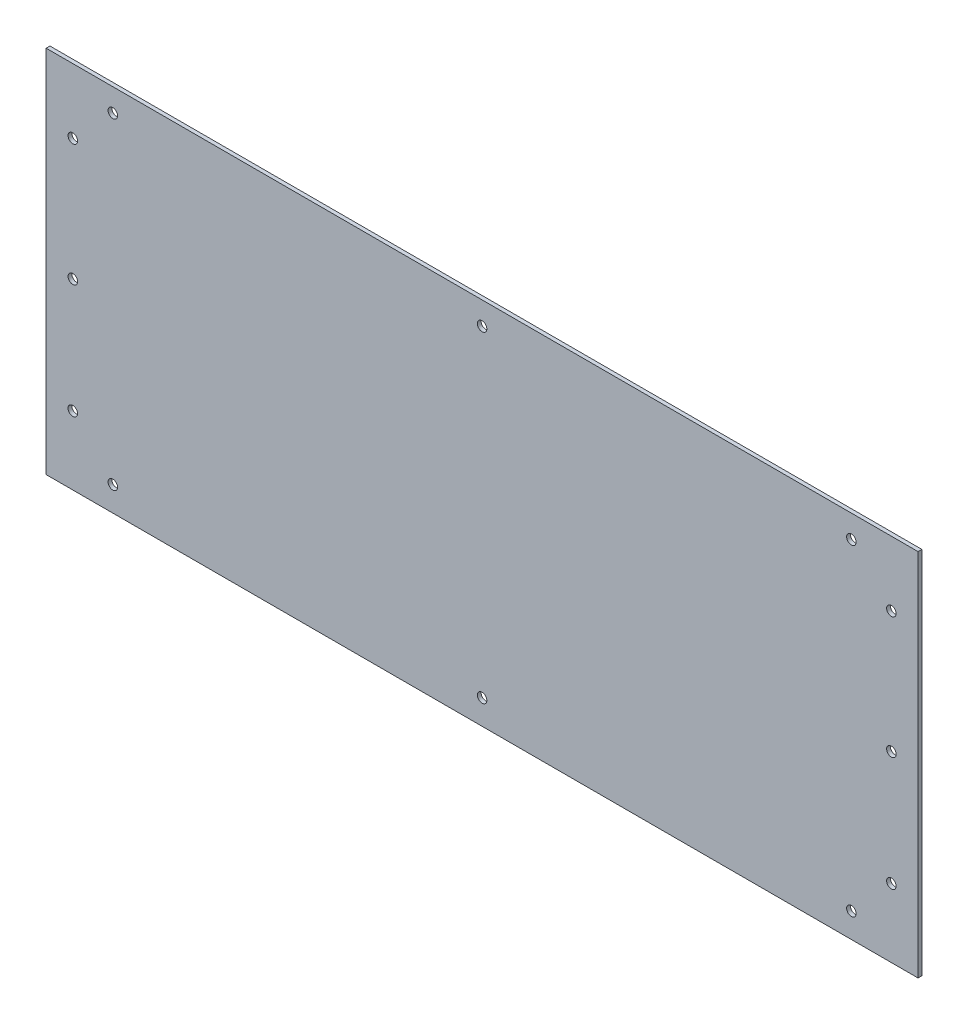
ISO-10303-21;
HEADER;
FILE_DESCRIPTION(('STEP AP214'),'2;1');
FILE_NAME('part.step','',(''),(''),'','','');
FILE_SCHEMA(('AUTOMOTIVE_DESIGN { 1 0 10303 214 1 1 1 1 }'));
ENDSEC;
DATA;
#1=APPLICATION_CONTEXT('core data for automotive mechanical design processes');
#2=APPLICATION_PROTOCOL_DEFINITION('international standard','automotive_design',2000,#1);
#3=PRODUCT_CONTEXT('',#1,'mechanical');
#4=PRODUCT('Part','Part','',(#3));
#5=PRODUCT_RELATED_PRODUCT_CATEGORY('part','',(#4));
#6=PRODUCT_DEFINITION_FORMATION('','',#4);
#7=PRODUCT_DEFINITION_CONTEXT('part definition',#1,'design');
#8=PRODUCT_DEFINITION('design','',#6,#7);
#9=PRODUCT_DEFINITION_SHAPE('','',#8);
#10=(LENGTH_UNIT() NAMED_UNIT(*) SI_UNIT(.MILLI.,.METRE.));
#11=(NAMED_UNIT(*) PLANE_ANGLE_UNIT() SI_UNIT($,.RADIAN.));
#12=(NAMED_UNIT(*) SI_UNIT($,.STERADIAN.) SOLID_ANGLE_UNIT());
#13=UNCERTAINTY_MEASURE_WITH_UNIT(LENGTH_MEASURE(1.E-05),#10,'distance_accuracy_value','');
#14=(GEOMETRIC_REPRESENTATION_CONTEXT(3) GLOBAL_UNCERTAINTY_ASSIGNED_CONTEXT((#13)) GLOBAL_UNIT_ASSIGNED_CONTEXT((#10,
#11,#12)) REPRESENTATION_CONTEXT('',''));
#15=CARTESIAN_POINT('',(0.,0.,0.));
#16=DIRECTION('',(0.,0.,1.));
#17=DIRECTION('',(1.,0.,0.));
#18=AXIS2_PLACEMENT_3D('',#15,#16,#17);
#19=CARTESIAN_POINT('',(229.,96.,2.));
#20=DIRECTION('',(-1.,0.,0.));
#21=DIRECTION('',(0.,-1.,0.));
#22=AXIS2_PLACEMENT_3D('',#19,#20,#21);
#23=PLANE('',#22);
#24=DIRECTION('',(0.,1.,0.));
#25=VECTOR('',#24,1.);
#26=CARTESIAN_POINT('',(229.,96.,0.));
#27=LINE('',#26,#25);
#28=CARTESIAN_POINT('',(229.,-96.,0.));
#29=VERTEX_POINT('',#28);
#30=CARTESIAN_POINT('',(229.,98.,0.));
#31=VERTEX_POINT('',#30);
#32=EDGE_CURVE('E206',#29,#31,#27,.T.);
#33=ORIENTED_EDGE('',*,*,#32,.T.);
#34=DIRECTION('',(0.,0.,1.));
#35=VECTOR('',#34,1.);
#36=CARTESIAN_POINT('',(229.,98.,0.));
#37=LINE('',#36,#35);
#38=CARTESIAN_POINT('',(229.,98.,2.));
#39=VERTEX_POINT('',#38);
#40=EDGE_CURVE('E102',#31,#39,#37,.T.);
#41=ORIENTED_EDGE('',*,*,#40,.T.);
#42=DIRECTION('',(0.,1.,0.));
#43=VECTOR('',#42,1.);
#44=CARTESIAN_POINT('',(229.,96.,2.));
#45=LINE('',#44,#43);
#46=CARTESIAN_POINT('',(229.,-96.,2.));
#47=VERTEX_POINT('',#46);
#48=EDGE_CURVE('E92',#47,#39,#45,.T.);
#49=ORIENTED_EDGE('',*,*,#48,.F.);
#50=DIRECTION('',(0.,0.,-1.));
#51=VECTOR('',#50,1.);
#52=CARTESIAN_POINT('',(229.,-96.,2.));
#53=LINE('',#52,#51);
#54=EDGE_CURVE('E53',#47,#29,#53,.T.);
#55=ORIENTED_EDGE('',*,*,#54,.T.);
#56=EDGE_LOOP('',(#33,#41,#49,#55));
#57=FACE_BOUND('',#56,.T.);
#58=ADVANCED_FACE('F44',(#57),#23,.F.);
#59=CARTESIAN_POINT('',(-229.,96.,2.));
#60=DIRECTION('',(1.,0.,0.));
#61=DIRECTION('',(0.,1.,0.));
#62=AXIS2_PLACEMENT_3D('',#59,#60,#61);
#63=PLANE('',#62);
#64=DIRECTION('',(0.,-1.,0.));
#65=VECTOR('',#64,1.);
#66=CARTESIAN_POINT('',(-229.,96.,0.));
#67=LINE('',#66,#65);
#68=CARTESIAN_POINT('',(-229.,98.,0.));
#69=VERTEX_POINT('',#68);
#70=CARTESIAN_POINT('',(-229.,-96.,0.));
#71=VERTEX_POINT('',#70);
#72=EDGE_CURVE('E72',#69,#71,#67,.T.);
#73=ORIENTED_EDGE('',*,*,#72,.T.);
#74=DIRECTION('',(0.,0.,-1.));
#75=VECTOR('',#74,1.);
#76=CARTESIAN_POINT('',(-229.,-96.,2.));
#77=LINE('',#76,#75);
#78=CARTESIAN_POINT('',(-229.,-96.,2.));
#79=VERTEX_POINT('',#78);
#80=EDGE_CURVE('E11',#79,#71,#77,.T.);
#81=ORIENTED_EDGE('',*,*,#80,.F.);
#82=DIRECTION('',(0.,-1.,0.));
#83=VECTOR('',#82,1.);
#84=CARTESIAN_POINT('',(-229.,96.,2.));
#85=LINE('',#84,#83);
#86=CARTESIAN_POINT('',(-229.,98.,2.));
#87=VERTEX_POINT('',#86);
#88=EDGE_CURVE('E85',#87,#79,#85,.T.);
#89=ORIENTED_EDGE('',*,*,#88,.F.);
#90=DIRECTION('',(0.,0.,1.));
#91=VECTOR('',#90,1.);
#92=CARTESIAN_POINT('',(-229.,98.,0.));
#93=LINE('',#92,#91);
#94=EDGE_CURVE('E88',#69,#87,#93,.T.);
#95=ORIENTED_EDGE('',*,*,#94,.F.);
#96=EDGE_LOOP('',(#73,#81,#89,#95));
#97=FACE_BOUND('',#96,.T.);
#98=ADVANCED_FACE('F87',(#97),#63,.F.);
#99=CARTESIAN_POINT('',(-229.,-96.,2.));
#100=DIRECTION('',(0.,1.,0.));
#101=DIRECTION('',(0.,0.,1.));
#102=AXIS2_PLACEMENT_3D('',#99,#100,#101);
#103=PLANE('',#102);
#104=DIRECTION('',(1.,0.,0.));
#105=VECTOR('',#104,1.);
#106=CARTESIAN_POINT('',(-229.,-96.,0.));
#107=LINE('',#106,#105);
#108=EDGE_CURVE('E211',#71,#29,#107,.T.);
#109=ORIENTED_EDGE('',*,*,#108,.T.);
#110=ORIENTED_EDGE('',*,*,#54,.F.);
#111=DIRECTION('',(1.,0.,0.));
#112=VECTOR('',#111,1.);
#113=CARTESIAN_POINT('',(-229.,-96.,2.));
#114=LINE('',#113,#112);
#115=EDGE_CURVE('E61',#79,#47,#114,.T.);
#116=ORIENTED_EDGE('',*,*,#115,.F.);
#117=ORIENTED_EDGE('',*,*,#80,.T.);
#118=EDGE_LOOP('',(#109,#110,#116,#117));
#119=FACE_BOUND('',#118,.T.);
#120=ADVANCED_FACE('F226',(#119),#103,.F.);
#121=CARTESIAN_POINT('',(0.,0.,2.));
#122=DIRECTION('',(0.,0.,1.));
#123=DIRECTION('',(1.,0.,0.));
#124=AXIS2_PLACEMENT_3D('',#121,#122,#123);
#125=PLANE('',#124);
#126=CARTESIAN_POINT('',(215.,-59.9999999999999,2.));
#127=DIRECTION('',(0.,0.,1.));
#128=DIRECTION('',(1.,0.,0.));
#129=AXIS2_PLACEMENT_3D('',#126,#127,#128);
#130=CIRCLE('',#129,2.49999999999991);
#131=CARTESIAN_POINT('',(217.5,-59.9999999999999,2.));
#132=VERTEX_POINT('',#131);
#133=EDGE_CURVE('E163',#132,#132,#130,.T.);
#134=ORIENTED_EDGE('',*,*,#133,.F.);
#135=EDGE_LOOP('',(#134));
#136=FACE_BOUND('',#135,.T.);
#137=CARTESIAN_POINT('',(215.,1.11022302462516E-13,2.));
#138=DIRECTION('',(0.,0.,1.));
#139=DIRECTION('',(1.,0.,0.));
#140=AXIS2_PLACEMENT_3D('',#137,#138,#139);
#141=CIRCLE('',#140,2.49999999999991);
#142=CARTESIAN_POINT('',(217.5,1.11022302462516E-13,2.));
#143=VERTEX_POINT('',#142);
#144=EDGE_CURVE('E155',#143,#143,#141,.T.);
#145=ORIENTED_EDGE('',*,*,#144,.F.);
#146=EDGE_LOOP('',(#145));
#147=FACE_BOUND('',#146,.T.);
#148=CARTESIAN_POINT('',(-215.,64.,2.));
#149=DIRECTION('',(0.,0.,1.));
#150=DIRECTION('',(1.,0.,0.));
#151=AXIS2_PLACEMENT_3D('',#148,#149,#150);
#152=CIRCLE('',#151,2.50000000000013);
#153=CARTESIAN_POINT('',(-212.5,64.,2.));
#154=VERTEX_POINT('',#153);
#155=EDGE_CURVE('E147',#154,#154,#152,.T.);
#156=ORIENTED_EDGE('',*,*,#155,.F.);
#157=EDGE_LOOP('',(#156));
#158=FACE_BOUND('',#157,.T.);
#159=CARTESIAN_POINT('',(-215.,-60.,2.));
#160=DIRECTION('',(0.,0.,1.));
#161=DIRECTION('',(1.,0.,0.));
#162=AXIS2_PLACEMENT_3D('',#159,#160,#161);
#163=CIRCLE('',#162,2.50000000000014);
#164=CARTESIAN_POINT('',(-212.5,-60.,2.));
#165=VERTEX_POINT('',#164);
#166=EDGE_CURVE('E138',#165,#165,#163,.T.);
#167=ORIENTED_EDGE('',*,*,#166,.F.);
#168=EDGE_LOOP('',(#167));
#169=FACE_BOUND('',#168,.T.);
#170=CARTESIAN_POINT('',(-215.,0.,2.));
#171=DIRECTION('',(0.,0.,1.));
#172=DIRECTION('',(1.,0.,0.));
#173=AXIS2_PLACEMENT_3D('',#170,#171,#172);
#174=CIRCLE('',#173,2.50000000000014);
#175=CARTESIAN_POINT('',(-212.5,0.,2.));
#176=VERTEX_POINT('',#175);
#177=EDGE_CURVE('E195',#176,#176,#174,.T.);
#178=ORIENTED_EDGE('',*,*,#177,.F.);
#179=EDGE_LOOP('',(#178));
#180=FACE_BOUND('',#179,.T.);
#181=CARTESIAN_POINT('',(194.,86.,2.));
#182=DIRECTION('',(0.,0.,1.));
#183=DIRECTION('',(1.,0.,0.));
#184=AXIS2_PLACEMENT_3D('',#181,#182,#183);
#185=CIRCLE('',#184,2.50000000000037);
#186=CARTESIAN_POINT('',(196.5,86.,2.));
#187=VERTEX_POINT('',#186);
#188=EDGE_CURVE('E187',#187,#187,#185,.T.);
#189=ORIENTED_EDGE('',*,*,#188,.F.);
#190=EDGE_LOOP('',(#189));
#191=FACE_BOUND('',#190,.T.);
#192=CARTESIAN_POINT('',(194.,-83.0045925405617,2.));
#193=DIRECTION('',(0.,0.,1.));
#194=DIRECTION('',(1.,0.,0.));
#195=AXIS2_PLACEMENT_3D('',#192,#193,#194);
#196=CIRCLE('',#195,2.50000000000014);
#197=CARTESIAN_POINT('',(196.5,-83.0045925405617,2.));
#198=VERTEX_POINT('',#197);
#199=EDGE_CURVE('E179',#198,#198,#196,.T.);
#200=ORIENTED_EDGE('',*,*,#199,.F.);
#201=EDGE_LOOP('',(#200));
#202=FACE_BOUND('',#201,.T.);
#203=CARTESIAN_POINT('',(-194.,-83.0045925405617,2.));
#204=DIRECTION('',(0.,0.,1.));
#205=DIRECTION('',(1.,0.,0.));
#206=AXIS2_PLACEMENT_3D('',#203,#204,#205);
#207=CIRCLE('',#206,2.50000000000014);
#208=CARTESIAN_POINT('',(-191.5,-83.0045925405617,2.));
#209=VERTEX_POINT('',#208);
#210=EDGE_CURVE('E170',#209,#209,#207,.T.);
#211=ORIENTED_EDGE('',*,*,#210,.F.);
#212=EDGE_LOOP('',(#211));
#213=FACE_BOUND('',#212,.T.);
#214=CARTESIAN_POINT('',(215.,64.0000000000001,2.));
#215=DIRECTION('',(0.,0.,1.));
#216=DIRECTION('',(1.,0.,0.));
#217=AXIS2_PLACEMENT_3D('',#214,#215,#216);
#218=CIRCLE('',#217,2.49999999999992);
#219=CARTESIAN_POINT('',(217.5,64.0000000000001,2.));
#220=VERTEX_POINT('',#219);
#221=EDGE_CURVE('E114',#220,#220,#218,.T.);
#222=ORIENTED_EDGE('',*,*,#221,.F.);
#223=EDGE_LOOP('',(#222));
#224=FACE_BOUND('',#223,.T.);
#225=CARTESIAN_POINT('',(-1.11022302462516E-13,86.,2.));
#226=DIRECTION('',(0.,0.,1.));
#227=DIRECTION('',(1.,0.,0.));
#228=AXIS2_PLACEMENT_3D('',#225,#226,#227);
#229=CIRCLE('',#228,2.49999999999992);
#230=CARTESIAN_POINT('',(2.49999999999981,86.,2.));
#231=VERTEX_POINT('',#230);
#232=EDGE_CURVE('E123',#231,#231,#229,.T.);
#233=ORIENTED_EDGE('',*,*,#232,.F.);
#234=EDGE_LOOP('',(#233));
#235=FACE_BOUND('',#234,.T.);
#236=CARTESIAN_POINT('',(0.,-83.,2.));
#237=DIRECTION('',(0.,0.,1.));
#238=DIRECTION('',(1.,0.,0.));
#239=AXIS2_PLACEMENT_3D('',#236,#237,#238);
#240=CIRCLE('',#239,2.49999999999992);
#241=CARTESIAN_POINT('',(2.49999999999992,-83.,2.));
#242=VERTEX_POINT('',#241);
#243=EDGE_CURVE('E131',#242,#242,#240,.T.);
#244=ORIENTED_EDGE('',*,*,#243,.F.);
#245=EDGE_LOOP('',(#244));
#246=FACE_BOUND('',#245,.T.);
#247=CARTESIAN_POINT('',(-194.,86.,2.));
#248=DIRECTION('',(0.,0.,1.));
#249=DIRECTION('',(1.,0.,0.));
#250=AXIS2_PLACEMENT_3D('',#247,#248,#249);
#251=CIRCLE('',#250,2.50000000000013);
#252=CARTESIAN_POINT('',(-191.5,86.,2.));
#253=VERTEX_POINT('',#252);
#254=EDGE_CURVE('E174',#253,#253,#251,.T.);
#255=ORIENTED_EDGE('',*,*,#254,.F.);
#256=EDGE_LOOP('',(#255));
#257=FACE_BOUND('',#256,.T.);
#258=ORIENTED_EDGE('',*,*,#48,.T.);
#259=DIRECTION('',(-1.,0.,0.));
#260=VECTOR('',#259,1.);
#261=CARTESIAN_POINT('',(-229.,98.,2.));
#262=LINE('',#261,#260);
#263=EDGE_CURVE('E98',#39,#87,#262,.T.);
#264=ORIENTED_EDGE('',*,*,#263,.T.);
#265=ORIENTED_EDGE('',*,*,#88,.T.);
#266=ORIENTED_EDGE('',*,*,#115,.T.);
#267=EDGE_LOOP('',(#258,#264,#265,#266));
#268=FACE_BOUND('',#267,.T.);
#269=ADVANCED_FACE('F104',(#136,#147,#158,#169,#180,#191,#202,#213,#224,#235,#246,#257,#268),
#125,.T.);
#270=CARTESIAN_POINT('',(0.,0.,0.));
#271=DIRECTION('',(0.,0.,1.));
#272=DIRECTION('',(1.,0.,0.));
#273=AXIS2_PLACEMENT_3D('',#270,#271,#272);
#274=PLANE('',#273);
#275=CARTESIAN_POINT('',(215.,-59.9999999999999,0.));
#276=DIRECTION('',(0.,0.,1.));
#277=DIRECTION('',(1.,0.,0.));
#278=AXIS2_PLACEMENT_3D('',#275,#276,#277);
#279=CIRCLE('',#278,2.49999999999991);
#280=CARTESIAN_POINT('',(217.5,-59.9999999999999,0.));
#281=VERTEX_POINT('',#280);
#282=EDGE_CURVE('E118',#281,#281,#279,.T.);
#283=ORIENTED_EDGE('',*,*,#282,.T.);
#284=EDGE_LOOP('',(#283));
#285=FACE_BOUND('',#284,.T.);
#286=CARTESIAN_POINT('',(215.,1.11022302462516E-13,0.));
#287=DIRECTION('',(0.,0.,1.));
#288=DIRECTION('',(1.,0.,0.));
#289=AXIS2_PLACEMENT_3D('',#286,#287,#288);
#290=CIRCLE('',#289,2.49999999999991);
#291=CARTESIAN_POINT('',(217.5,1.11022302462516E-13,0.));
#292=VERTEX_POINT('',#291);
#293=EDGE_CURVE('E159',#292,#292,#290,.T.);
#294=ORIENTED_EDGE('',*,*,#293,.T.);
#295=EDGE_LOOP('',(#294));
#296=FACE_BOUND('',#295,.T.);
#297=CARTESIAN_POINT('',(-215.,64.,0.));
#298=DIRECTION('',(0.,0.,1.));
#299=DIRECTION('',(1.,0.,0.));
#300=AXIS2_PLACEMENT_3D('',#297,#298,#299);
#301=CIRCLE('',#300,2.50000000000013);
#302=CARTESIAN_POINT('',(-212.5,64.,0.));
#303=VERTEX_POINT('',#302);
#304=EDGE_CURVE('E151',#303,#303,#301,.T.);
#305=ORIENTED_EDGE('',*,*,#304,.T.);
#306=EDGE_LOOP('',(#305));
#307=FACE_BOUND('',#306,.T.);
#308=CARTESIAN_POINT('',(-215.,-60.,0.));
#309=DIRECTION('',(0.,0.,1.));
#310=DIRECTION('',(1.,0.,0.));
#311=AXIS2_PLACEMENT_3D('',#308,#309,#310);
#312=CIRCLE('',#311,2.50000000000014);
#313=CARTESIAN_POINT('',(-212.5,-60.,0.));
#314=VERTEX_POINT('',#313);
#315=EDGE_CURVE('E143',#314,#314,#312,.T.);
#316=ORIENTED_EDGE('',*,*,#315,.T.);
#317=EDGE_LOOP('',(#316));
#318=FACE_BOUND('',#317,.T.);
#319=CARTESIAN_POINT('',(-215.,0.,0.));
#320=DIRECTION('',(0.,0.,1.));
#321=DIRECTION('',(1.,0.,0.));
#322=AXIS2_PLACEMENT_3D('',#319,#320,#321);
#323=CIRCLE('',#322,2.50000000000014);
#324=CARTESIAN_POINT('',(-212.5,0.,0.));
#325=VERTEX_POINT('',#324);
#326=EDGE_CURVE('E142',#325,#325,#323,.T.);
#327=ORIENTED_EDGE('',*,*,#326,.T.);
#328=EDGE_LOOP('',(#327));
#329=FACE_BOUND('',#328,.T.);
#330=CARTESIAN_POINT('',(194.,86.,0.));
#331=DIRECTION('',(0.,0.,1.));
#332=DIRECTION('',(1.,0.,0.));
#333=AXIS2_PLACEMENT_3D('',#330,#331,#332);
#334=CIRCLE('',#333,2.50000000000037);
#335=CARTESIAN_POINT('',(196.5,86.,0.));
#336=VERTEX_POINT('',#335);
#337=EDGE_CURVE('E191',#336,#336,#334,.T.);
#338=ORIENTED_EDGE('',*,*,#337,.T.);
#339=EDGE_LOOP('',(#338));
#340=FACE_BOUND('',#339,.T.);
#341=CARTESIAN_POINT('',(194.,-83.0045925405617,0.));
#342=DIRECTION('',(0.,0.,1.));
#343=DIRECTION('',(1.,0.,0.));
#344=AXIS2_PLACEMENT_3D('',#341,#342,#343);
#345=CIRCLE('',#344,2.50000000000014);
#346=CARTESIAN_POINT('',(196.5,-83.0045925405617,0.));
#347=VERTEX_POINT('',#346);
#348=EDGE_CURVE('E183',#347,#347,#345,.T.);
#349=ORIENTED_EDGE('',*,*,#348,.T.);
#350=EDGE_LOOP('',(#349));
#351=FACE_BOUND('',#350,.T.);
#352=CARTESIAN_POINT('',(-194.,-83.0045925405617,0.));
#353=DIRECTION('',(0.,0.,1.));
#354=DIRECTION('',(1.,0.,0.));
#355=AXIS2_PLACEMENT_3D('',#352,#353,#354);
#356=CIRCLE('',#355,2.50000000000014);
#357=CARTESIAN_POINT('',(-191.5,-83.0045925405617,0.));
#358=VERTEX_POINT('',#357);
#359=EDGE_CURVE('E175',#358,#358,#356,.T.);
#360=ORIENTED_EDGE('',*,*,#359,.T.);
#361=EDGE_LOOP('',(#360));
#362=FACE_BOUND('',#361,.T.);
#363=CARTESIAN_POINT('',(215.,64.0000000000001,0.));
#364=DIRECTION('',(0.,0.,1.));
#365=DIRECTION('',(1.,0.,0.));
#366=AXIS2_PLACEMENT_3D('',#363,#364,#365);
#367=CIRCLE('',#366,2.49999999999992);
#368=CARTESIAN_POINT('',(217.5,64.0000000000001,0.));
#369=VERTEX_POINT('',#368);
#370=EDGE_CURVE('E119',#369,#369,#367,.T.);
#371=ORIENTED_EDGE('',*,*,#370,.T.);
#372=EDGE_LOOP('',(#371));
#373=FACE_BOUND('',#372,.T.);
#374=CARTESIAN_POINT('',(-1.11022302462516E-13,86.,0.));
#375=DIRECTION('',(0.,0.,1.));
#376=DIRECTION('',(1.,0.,0.));
#377=AXIS2_PLACEMENT_3D('',#374,#375,#376);
#378=CIRCLE('',#377,2.49999999999992);
#379=CARTESIAN_POINT('',(2.49999999999981,86.,0.));
#380=VERTEX_POINT('',#379);
#381=EDGE_CURVE('E127',#380,#380,#378,.T.);
#382=ORIENTED_EDGE('',*,*,#381,.T.);
#383=EDGE_LOOP('',(#382));
#384=FACE_BOUND('',#383,.T.);
#385=CARTESIAN_POINT('',(0.,-83.,0.));
#386=DIRECTION('',(0.,0.,1.));
#387=DIRECTION('',(1.,0.,0.));
#388=AXIS2_PLACEMENT_3D('',#385,#386,#387);
#389=CIRCLE('',#388,2.49999999999992);
#390=CARTESIAN_POINT('',(2.49999999999992,-83.,0.));
#391=VERTEX_POINT('',#390);
#392=EDGE_CURVE('E101',#391,#391,#389,.T.);
#393=ORIENTED_EDGE('',*,*,#392,.T.);
#394=EDGE_LOOP('',(#393));
#395=FACE_BOUND('',#394,.T.);
#396=CARTESIAN_POINT('',(-194.,86.,0.));
#397=DIRECTION('',(0.,0.,1.));
#398=DIRECTION('',(1.,0.,0.));
#399=AXIS2_PLACEMENT_3D('',#396,#397,#398);
#400=CIRCLE('',#399,2.50000000000013);
#401=CARTESIAN_POINT('',(-191.5,86.,0.));
#402=VERTEX_POINT('',#401);
#403=EDGE_CURVE('E202',#402,#402,#400,.T.);
#404=ORIENTED_EDGE('',*,*,#403,.T.);
#405=EDGE_LOOP('',(#404));
#406=FACE_BOUND('',#405,.T.);
#407=ORIENTED_EDGE('',*,*,#32,.F.);
#408=ORIENTED_EDGE('',*,*,#108,.F.);
#409=ORIENTED_EDGE('',*,*,#72,.F.);
#410=DIRECTION('',(-1.,0.,0.));
#411=VECTOR('',#410,1.);
#412=CARTESIAN_POINT('',(-229.,98.,0.));
#413=LINE('',#412,#411);
#414=EDGE_CURVE('E99',#31,#69,#413,.T.);
#415=ORIENTED_EDGE('',*,*,#414,.F.);
#416=EDGE_LOOP('',(#407,#408,#409,#415));
#417=FACE_BOUND('',#416,.T.);
#418=ADVANCED_FACE('F225',(#285,#296,#307,#318,#329,#340,#351,#362,#373,#384,#395,#406,#417),
#274,.F.);
#419=CARTESIAN_POINT('',(-194.,86.,0.));
#420=DIRECTION('',(0.,0.,1.));
#421=DIRECTION('',(1.,0.,0.));
#422=AXIS2_PLACEMENT_3D('',#419,#420,#421);
#423=CYLINDRICAL_SURFACE('',#422,2.50000000000013);
#424=ORIENTED_EDGE('',*,*,#403,.F.);
#425=EDGE_LOOP('',(#424));
#426=FACE_BOUND('',#425,.T.);
#427=ORIENTED_EDGE('',*,*,#254,.T.);
#428=EDGE_LOOP('',(#427));
#429=FACE_BOUND('',#428,.T.);
#430=ADVANCED_FACE('F261',(#426,#429),#423,.F.);
#431=CARTESIAN_POINT('',(0.,-83.,0.));
#432=DIRECTION('',(0.,0.,1.));
#433=DIRECTION('',(1.,0.,0.));
#434=AXIS2_PLACEMENT_3D('',#431,#432,#433);
#435=CYLINDRICAL_SURFACE('',#434,2.49999999999992);
#436=ORIENTED_EDGE('',*,*,#392,.F.);
#437=EDGE_LOOP('',(#436));
#438=FACE_BOUND('',#437,.T.);
#439=ORIENTED_EDGE('',*,*,#243,.T.);
#440=EDGE_LOOP('',(#439));
#441=FACE_BOUND('',#440,.T.);
#442=ADVANCED_FACE('F352',(#438,#441),#435,.F.);
#443=CARTESIAN_POINT('',(-1.11022302462516E-13,86.,0.));
#444=DIRECTION('',(0.,0.,1.));
#445=DIRECTION('',(1.,0.,0.));
#446=AXIS2_PLACEMENT_3D('',#443,#444,#445);
#447=CYLINDRICAL_SURFACE('',#446,2.49999999999992);
#448=ORIENTED_EDGE('',*,*,#381,.F.);
#449=EDGE_LOOP('',(#448));
#450=FACE_BOUND('',#449,.T.);
#451=ORIENTED_EDGE('',*,*,#232,.T.);
#452=EDGE_LOOP('',(#451));
#453=FACE_BOUND('',#452,.T.);
#454=ADVANCED_FACE('F344',(#450,#453),#447,.F.);
#455=CARTESIAN_POINT('',(215.,64.0000000000001,0.));
#456=DIRECTION('',(0.,0.,1.));
#457=DIRECTION('',(1.,0.,0.));
#458=AXIS2_PLACEMENT_3D('',#455,#456,#457);
#459=CYLINDRICAL_SURFACE('',#458,2.49999999999992);
#460=ORIENTED_EDGE('',*,*,#370,.F.);
#461=EDGE_LOOP('',(#460));
#462=FACE_BOUND('',#461,.T.);
#463=ORIENTED_EDGE('',*,*,#221,.T.);
#464=EDGE_LOOP('',(#463));
#465=FACE_BOUND('',#464,.T.);
#466=ADVANCED_FACE('F336',(#462,#465),#459,.F.);
#467=CARTESIAN_POINT('',(-194.,-83.0045925405617,0.));
#468=DIRECTION('',(0.,0.,1.));
#469=DIRECTION('',(1.,0.,0.));
#470=AXIS2_PLACEMENT_3D('',#467,#468,#469);
#471=CYLINDRICAL_SURFACE('',#470,2.50000000000014);
#472=ORIENTED_EDGE('',*,*,#359,.F.);
#473=EDGE_LOOP('',(#472));
#474=FACE_BOUND('',#473,.T.);
#475=ORIENTED_EDGE('',*,*,#210,.T.);
#476=EDGE_LOOP('',(#475));
#477=FACE_BOUND('',#476,.T.);
#478=ADVANCED_FACE('F328',(#474,#477),#471,.F.);
#479=CARTESIAN_POINT('',(194.,-83.0045925405617,0.));
#480=DIRECTION('',(0.,0.,1.));
#481=DIRECTION('',(1.,0.,0.));
#482=AXIS2_PLACEMENT_3D('',#479,#480,#481);
#483=CYLINDRICAL_SURFACE('',#482,2.50000000000014);
#484=ORIENTED_EDGE('',*,*,#348,.F.);
#485=EDGE_LOOP('',(#484));
#486=FACE_BOUND('',#485,.T.);
#487=ORIENTED_EDGE('',*,*,#199,.T.);
#488=EDGE_LOOP('',(#487));
#489=FACE_BOUND('',#488,.T.);
#490=ADVANCED_FACE('F320',(#486,#489),#483,.F.);
#491=CARTESIAN_POINT('',(194.,86.,0.));
#492=DIRECTION('',(0.,0.,1.));
#493=DIRECTION('',(1.,0.,0.));
#494=AXIS2_PLACEMENT_3D('',#491,#492,#493);
#495=CYLINDRICAL_SURFACE('',#494,2.50000000000037);
#496=ORIENTED_EDGE('',*,*,#337,.F.);
#497=EDGE_LOOP('',(#496));
#498=FACE_BOUND('',#497,.T.);
#499=ORIENTED_EDGE('',*,*,#188,.T.);
#500=EDGE_LOOP('',(#499));
#501=FACE_BOUND('',#500,.T.);
#502=ADVANCED_FACE('F312',(#498,#501),#495,.F.);
#503=CARTESIAN_POINT('',(-215.,0.,0.));
#504=DIRECTION('',(0.,0.,1.));
#505=DIRECTION('',(1.,0.,0.));
#506=AXIS2_PLACEMENT_3D('',#503,#504,#505);
#507=CYLINDRICAL_SURFACE('',#506,2.50000000000014);
#508=ORIENTED_EDGE('',*,*,#326,.F.);
#509=EDGE_LOOP('',(#508));
#510=FACE_BOUND('',#509,.T.);
#511=ORIENTED_EDGE('',*,*,#177,.T.);
#512=EDGE_LOOP('',(#511));
#513=FACE_BOUND('',#512,.T.);
#514=ADVANCED_FACE('F304',(#510,#513),#507,.F.);
#515=CARTESIAN_POINT('',(-215.,-60.,0.));
#516=DIRECTION('',(0.,0.,1.));
#517=DIRECTION('',(1.,0.,0.));
#518=AXIS2_PLACEMENT_3D('',#515,#516,#517);
#519=CYLINDRICAL_SURFACE('',#518,2.50000000000014);
#520=ORIENTED_EDGE('',*,*,#315,.F.);
#521=EDGE_LOOP('',(#520));
#522=FACE_BOUND('',#521,.T.);
#523=ORIENTED_EDGE('',*,*,#166,.T.);
#524=EDGE_LOOP('',(#523));
#525=FACE_BOUND('',#524,.T.);
#526=ADVANCED_FACE('F296',(#522,#525),#519,.F.);
#527=CARTESIAN_POINT('',(-215.,64.,0.));
#528=DIRECTION('',(0.,0.,1.));
#529=DIRECTION('',(1.,0.,0.));
#530=AXIS2_PLACEMENT_3D('',#527,#528,#529);
#531=CYLINDRICAL_SURFACE('',#530,2.50000000000013);
#532=ORIENTED_EDGE('',*,*,#304,.F.);
#533=EDGE_LOOP('',(#532));
#534=FACE_BOUND('',#533,.T.);
#535=ORIENTED_EDGE('',*,*,#155,.T.);
#536=EDGE_LOOP('',(#535));
#537=FACE_BOUND('',#536,.T.);
#538=ADVANCED_FACE('F288',(#534,#537),#531,.F.);
#539=CARTESIAN_POINT('',(215.,1.11022302462516E-13,0.));
#540=DIRECTION('',(0.,0.,1.));
#541=DIRECTION('',(1.,0.,0.));
#542=AXIS2_PLACEMENT_3D('',#539,#540,#541);
#543=CYLINDRICAL_SURFACE('',#542,2.49999999999991);
#544=ORIENTED_EDGE('',*,*,#293,.F.);
#545=EDGE_LOOP('',(#544));
#546=FACE_BOUND('',#545,.T.);
#547=ORIENTED_EDGE('',*,*,#144,.T.);
#548=EDGE_LOOP('',(#547));
#549=FACE_BOUND('',#548,.T.);
#550=ADVANCED_FACE('F280',(#546,#549),#543,.F.);
#551=CARTESIAN_POINT('',(215.,-59.9999999999999,0.));
#552=DIRECTION('',(0.,0.,1.));
#553=DIRECTION('',(1.,0.,0.));
#554=AXIS2_PLACEMENT_3D('',#551,#552,#553);
#555=CYLINDRICAL_SURFACE('',#554,2.49999999999991);
#556=ORIENTED_EDGE('',*,*,#282,.F.);
#557=EDGE_LOOP('',(#556));
#558=FACE_BOUND('',#557,.T.);
#559=ORIENTED_EDGE('',*,*,#133,.T.);
#560=EDGE_LOOP('',(#559));
#561=FACE_BOUND('',#560,.T.);
#562=ADVANCED_FACE('F271',(#558,#561),#555,.F.);
#563=CARTESIAN_POINT('',(-229.,98.,0.));
#564=DIRECTION('',(0.,1.,0.));
#565=DIRECTION('',(0.,0.,1.));
#566=AXIS2_PLACEMENT_3D('',#563,#564,#565);
#567=PLANE('',#566);
#568=ORIENTED_EDGE('',*,*,#263,.F.);
#569=ORIENTED_EDGE('',*,*,#40,.F.);
#570=ORIENTED_EDGE('',*,*,#414,.T.);
#571=ORIENTED_EDGE('',*,*,#94,.T.);
#572=EDGE_LOOP('',(#568,#569,#570,#571));
#573=FACE_BOUND('',#572,.T.);
#574=ADVANCED_FACE('F96',(#573),#567,.T.);
#575=CLOSED_SHELL('',(#58,#98,#120,#269,#418,#430,#442,#454,#466,#478,#490,#502,#514,#526,#538,
#550,#562,#574));
#576=MANIFOLD_SOLID_BREP('B2',#575);
#577=ADVANCED_BREP_SHAPE_REPRESENTATION('',(#18,#576),#14);
#578=SHAPE_DEFINITION_REPRESENTATION(#9,#577);
ENDSEC;
END-ISO-10303-21;
